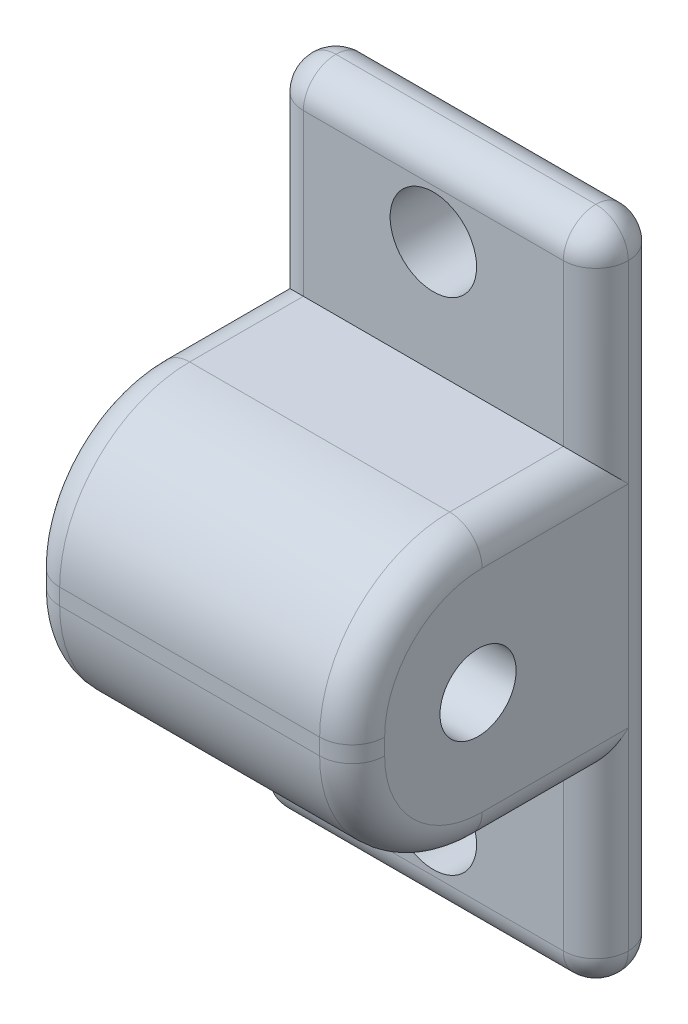
ISO-10303-21;
HEADER;
FILE_DESCRIPTION(('STEP AP214'),'2;1');
FILE_NAME('part.step','',(''),(''),'','','');
FILE_SCHEMA(('AUTOMOTIVE_DESIGN { 1 0 10303 214 1 1 1 1 }'));
ENDSEC;
DATA;
#1=APPLICATION_CONTEXT('core data for automotive mechanical design processes');
#2=APPLICATION_PROTOCOL_DEFINITION('international standard','automotive_design',2000,#1);
#3=PRODUCT_CONTEXT('',#1,'mechanical');
#4=PRODUCT('Part','Part','',(#3));
#5=PRODUCT_RELATED_PRODUCT_CATEGORY('part','',(#4));
#6=PRODUCT_DEFINITION_FORMATION('','',#4);
#7=PRODUCT_DEFINITION_CONTEXT('part definition',#1,'design');
#8=PRODUCT_DEFINITION('design','',#6,#7);
#9=PRODUCT_DEFINITION_SHAPE('','',#8);
#10=(LENGTH_UNIT() NAMED_UNIT(*) SI_UNIT(.MILLI.,.METRE.));
#11=(NAMED_UNIT(*) PLANE_ANGLE_UNIT() SI_UNIT($,.RADIAN.));
#12=(NAMED_UNIT(*) SI_UNIT($,.STERADIAN.) SOLID_ANGLE_UNIT());
#13=UNCERTAINTY_MEASURE_WITH_UNIT(LENGTH_MEASURE(1.E-05),#10,'distance_accuracy_value','');
#14=(GEOMETRIC_REPRESENTATION_CONTEXT(3) GLOBAL_UNCERTAINTY_ASSIGNED_CONTEXT((#13)) GLOBAL_UNIT_ASSIGNED_CONTEXT((#10,
#11,#12)) REPRESENTATION_CONTEXT('',''));
#15=CARTESIAN_POINT('',(0.,0.,0.));
#16=DIRECTION('',(0.,0.,1.));
#17=DIRECTION('',(1.,0.,0.));
#18=AXIS2_PLACEMENT_3D('',#15,#16,#17);
#19=CARTESIAN_POINT('',(-25.4,-10.795,5.08));
#20=DIRECTION('',(0.,0.,1.));
#21=DIRECTION('',(0.,-1.,0.));
#22=AXIS2_PLACEMENT_3D('',#19,#20,#21);
#23=PLANE('',#22);
#24=CARTESIAN_POINT('',(-12.7,-19.558,5.08));
#25=DIRECTION('',(0.,0.,1.));
#26=DIRECTION('',(1.,0.,0.));
#27=AXIS2_PLACEMENT_3D('',#24,#25,#26);
#28=CIRCLE('',#27,3.3782);
#29=CARTESIAN_POINT('',(-9.3218,-19.558,5.08));
#30=VERTEX_POINT('',#29);
#31=EDGE_CURVE('E322',#30,#30,#28,.T.);
#32=ORIENTED_EDGE('',*,*,#31,.F.);
#33=EDGE_LOOP('',(#32));
#34=FACE_BOUND('',#33,.T.);
#35=DIRECTION('',(0.,-1.,0.));
#36=VECTOR('',#35,1.);
#37=CARTESIAN_POINT('',(-25.4,-10.795,5.08));
#38=LINE('',#37,#36);
#39=CARTESIAN_POINT('',(-25.4,-8.255,5.08));
#40=VERTEX_POINT('',#39);
#41=CARTESIAN_POINT('',(-25.4,-23.368,5.08));
#42=VERTEX_POINT('',#41);
#43=EDGE_CURVE('E192',#40,#42,#38,.T.);
#44=ORIENTED_EDGE('',*,*,#43,.T.);
#45=DIRECTION('',(1.,0.,0.));
#46=VECTOR('',#45,1.);
#47=CARTESIAN_POINT('',(-25.4,-23.368,5.08));
#48=LINE('',#47,#46);
#49=CARTESIAN_POINT('',(-2.54,-23.368,5.08));
#50=VERTEX_POINT('',#49);
#51=EDGE_CURVE('E186',#42,#50,#48,.T.);
#52=ORIENTED_EDGE('',*,*,#51,.T.);
#53=DIRECTION('',(0.,-1.,0.));
#54=VECTOR('',#53,1.);
#55=CARTESIAN_POINT('',(-2.54,-10.795,5.08));
#56=LINE('',#55,#54);
#57=CARTESIAN_POINT('',(-2.54,-10.795,5.08));
#58=VERTEX_POINT('',#57);
#59=EDGE_CURVE('E190',#50,#58,#56,.F.);
#60=ORIENTED_EDGE('',*,*,#59,.T.);
#61=DIRECTION('',(1.,0.,0.));
#62=VECTOR('',#61,1.);
#63=CARTESIAN_POINT('',(-25.4,-10.795,5.08));
#64=LINE('',#63,#62);
#65=CARTESIAN_POINT('',(-22.86,-10.795,5.08));
#66=VERTEX_POINT('',#65);
#67=EDGE_CURVE('E336',#66,#58,#64,.T.);
#68=ORIENTED_EDGE('',*,*,#67,.F.);
#69=CARTESIAN_POINT('',(-22.86,-8.255,5.08));
#70=DIRECTION('',(0.,0.,1.));
#71=DIRECTION('',(0.,-1.,0.));
#72=AXIS2_PLACEMENT_3D('',#69,#70,#71);
#73=CIRCLE('',#72,2.54);
#74=EDGE_CURVE('E11',#66,#40,#73,.F.);
#75=ORIENTED_EDGE('',*,*,#74,.T.);
#76=EDGE_LOOP('',(#44,#52,#60,#68,#75));
#77=FACE_BOUND('',#76,.T.);
#78=ADVANCED_FACE('F35',(#34,#77),#23,.T.);
#79=CARTESIAN_POINT('',(-25.4,-10.795,13.9699999999999));
#80=DIRECTION('',(0.,-1.,0.));
#81=DIRECTION('',(0.,0.,-1.));
#82=AXIS2_PLACEMENT_3D('',#79,#80,#81);
#83=PLANE('',#82);
#84=ORIENTED_EDGE('',*,*,#67,.T.);
#85=DIRECTION('',(0.,0.,-1.));
#86=VECTOR('',#85,1.);
#87=CARTESIAN_POINT('',(-2.54,-10.795,13.9699999999999));
#88=LINE('',#87,#86);
#89=CARTESIAN_POINT('',(-2.54,-10.795,13.9699999999999));
#90=VERTEX_POINT('',#89);
#91=EDGE_CURVE('E380',#58,#90,#88,.F.);
#92=ORIENTED_EDGE('',*,*,#91,.T.);
#93=DIRECTION('',(1.,0.,0.));
#94=VECTOR('',#93,1.);
#95=CARTESIAN_POINT('',(-25.4,-10.795,13.9699999999999));
#96=LINE('',#95,#94);
#97=CARTESIAN_POINT('',(-22.86,-10.795,13.9699999999999));
#98=VERTEX_POINT('',#97);
#99=EDGE_CURVE('E339',#98,#90,#96,.T.);
#100=ORIENTED_EDGE('',*,*,#99,.F.);
#101=DIRECTION('',(0.,0.,-1.));
#102=VECTOR('',#101,1.);
#103=CARTESIAN_POINT('',(-22.86,-10.795,13.9699999999999));
#104=LINE('',#103,#102);
#105=EDGE_CURVE('E378',#98,#66,#104,.T.);
#106=ORIENTED_EDGE('',*,*,#105,.T.);
#107=EDGE_LOOP('',(#84,#92,#100,#106));
#108=FACE_BOUND('',#107,.T.);
#109=ADVANCED_FACE('F432',(#108),#83,.T.);
#110=CARTESIAN_POINT('',(-25.4,-0.634999999999998,13.97));
#111=DIRECTION('',(1.,0.,0.));
#112=DIRECTION('',(0.,0.,-1.));
#113=AXIS2_PLACEMENT_3D('',#110,#111,#112);
#114=CYLINDRICAL_SURFACE('',#113,10.16);
#115=DIRECTION('',(1.,0.,0.));
#116=VECTOR('',#115,1.);
#117=CARTESIAN_POINT('',(-25.4,-0.634999999999926,24.13));
#118=LINE('',#117,#116);
#119=CARTESIAN_POINT('',(-22.86,-0.634999999999926,24.13));
#120=VERTEX_POINT('',#119);
#121=CARTESIAN_POINT('',(-2.54,-0.634999999999926,24.13));
#122=VERTEX_POINT('',#121);
#123=EDGE_CURVE('E342',#120,#122,#118,.T.);
#124=ORIENTED_EDGE('',*,*,#123,.F.);
#125=CARTESIAN_POINT('',(-22.86,-0.634999999999998,13.97));
#126=DIRECTION('',(-1.,0.,0.));
#127=DIRECTION('',(0.,0.,1.));
#128=AXIS2_PLACEMENT_3D('',#125,#126,#127);
#129=CIRCLE('',#128,10.16);
#130=EDGE_CURVE('E398',#120,#98,#129,.F.);
#131=ORIENTED_EDGE('',*,*,#130,.T.);
#132=ORIENTED_EDGE('',*,*,#99,.T.);
#133=CARTESIAN_POINT('',(-2.54,-0.634999999999998,13.97));
#134=DIRECTION('',(-1.,0.,0.));
#135=DIRECTION('',(0.,0.,1.));
#136=AXIS2_PLACEMENT_3D('',#133,#134,#135);
#137=CIRCLE('',#136,10.16);
#138=EDGE_CURVE('E396',#90,#122,#137,.T.);
#139=ORIENTED_EDGE('',*,*,#138,.T.);
#140=EDGE_LOOP('',(#124,#131,#132,#139));
#141=FACE_BOUND('',#140,.T.);
#142=ADVANCED_FACE('F436',(#141),#114,.T.);
#143=CARTESIAN_POINT('',(-25.4,0.634999999999927,24.13));
#144=DIRECTION('',(0.,0.,1.));
#145=DIRECTION('',(1.,0.,0.));
#146=AXIS2_PLACEMENT_3D('',#143,#144,#145);
#147=PLANE('',#146);
#148=ORIENTED_EDGE('',*,*,#123,.T.);
#149=DIRECTION('',(0.,-1.,0.));
#150=VECTOR('',#149,1.);
#151=CARTESIAN_POINT('',(-2.54,0.634999999999928,24.13));
#152=LINE('',#151,#150);
#153=CARTESIAN_POINT('',(-2.54,0.634999999999928,24.13));
#154=VERTEX_POINT('',#153);
#155=EDGE_CURVE('E376',#122,#154,#152,.F.);
#156=ORIENTED_EDGE('',*,*,#155,.T.);
#157=DIRECTION('',(1.,0.,0.));
#158=VECTOR('',#157,1.);
#159=CARTESIAN_POINT('',(-25.4,0.634999999999928,24.13));
#160=LINE('',#159,#158);
#161=CARTESIAN_POINT('',(-22.86,0.634999999999928,24.13));
#162=VERTEX_POINT('',#161);
#163=EDGE_CURVE('E345',#162,#154,#160,.T.);
#164=ORIENTED_EDGE('',*,*,#163,.F.);
#165=DIRECTION('',(0.,-1.,0.));
#166=VECTOR('',#165,1.);
#167=CARTESIAN_POINT('',(-22.86,0.634999999999927,24.13));
#168=LINE('',#167,#166);
#169=EDGE_CURVE('E374',#162,#120,#168,.T.);
#170=ORIENTED_EDGE('',*,*,#169,.T.);
#171=EDGE_LOOP('',(#148,#156,#164,#170));
#172=FACE_BOUND('',#171,.T.);
#173=ADVANCED_FACE('F469',(#172),#147,.T.);
#174=CARTESIAN_POINT('',(-25.4,0.635,13.97));
#175=DIRECTION('',(1.,0.,0.));
#176=DIRECTION('',(0.,0.,-1.));
#177=AXIS2_PLACEMENT_3D('',#174,#175,#176);
#178=CYLINDRICAL_SURFACE('',#177,10.16);
#179=ORIENTED_EDGE('',*,*,#163,.T.);
#180=CARTESIAN_POINT('',(-2.54,0.635,13.97));
#181=DIRECTION('',(-1.,0.,0.));
#182=DIRECTION('',(0.,0.,1.));
#183=AXIS2_PLACEMENT_3D('',#180,#181,#182);
#184=CIRCLE('',#183,10.16);
#185=CARTESIAN_POINT('',(-2.54,10.795,13.9699999999999));
#186=VERTEX_POINT('',#185);
#187=EDGE_CURVE('E372',#154,#186,#184,.T.);
#188=ORIENTED_EDGE('',*,*,#187,.T.);
#189=DIRECTION('',(1.,0.,0.));
#190=VECTOR('',#189,1.);
#191=CARTESIAN_POINT('',(-25.4,10.795,13.9699999999999));
#192=LINE('',#191,#190);
#193=CARTESIAN_POINT('',(-22.86,10.795,13.9699999999999));
#194=VERTEX_POINT('',#193);
#195=EDGE_CURVE('E348',#194,#186,#192,.T.);
#196=ORIENTED_EDGE('',*,*,#195,.F.);
#197=CARTESIAN_POINT('',(-22.86,0.635,13.97));
#198=DIRECTION('',(-1.,0.,0.));
#199=DIRECTION('',(0.,0.,1.));
#200=AXIS2_PLACEMENT_3D('',#197,#198,#199);
#201=CIRCLE('',#200,10.16);
#202=EDGE_CURVE('E370',#194,#162,#201,.F.);
#203=ORIENTED_EDGE('',*,*,#202,.T.);
#204=EDGE_LOOP('',(#179,#188,#196,#203));
#205=FACE_BOUND('',#204,.T.);
#206=ADVANCED_FACE('F472',(#205),#178,.T.);
#207=CARTESIAN_POINT('',(-25.4,10.795,5.08));
#208=DIRECTION('',(0.,1.,0.));
#209=DIRECTION('',(0.,0.,1.));
#210=AXIS2_PLACEMENT_3D('',#207,#208,#209);
#211=PLANE('',#210);
#212=ORIENTED_EDGE('',*,*,#195,.T.);
#213=DIRECTION('',(0.,0.,1.));
#214=VECTOR('',#213,1.);
#215=CARTESIAN_POINT('',(-2.54,10.795,5.08));
#216=LINE('',#215,#214);
#217=CARTESIAN_POINT('',(-2.54,10.795,5.08));
#218=VERTEX_POINT('',#217);
#219=EDGE_CURVE('E367',#186,#218,#216,.F.);
#220=ORIENTED_EDGE('',*,*,#219,.T.);
#221=DIRECTION('',(1.,0.,0.));
#222=VECTOR('',#221,1.);
#223=CARTESIAN_POINT('',(-25.4,10.795,5.08));
#224=LINE('',#223,#222);
#225=CARTESIAN_POINT('',(-22.86,10.795,5.08));
#226=VERTEX_POINT('',#225);
#227=EDGE_CURVE('E335',#226,#218,#224,.T.);
#228=ORIENTED_EDGE('',*,*,#227,.F.);
#229=DIRECTION('',(0.,0.,1.));
#230=VECTOR('',#229,1.);
#231=CARTESIAN_POINT('',(-22.86,10.795,5.08));
#232=LINE('',#231,#230);
#233=EDGE_CURVE('E365',#226,#194,#232,.T.);
#234=ORIENTED_EDGE('',*,*,#233,.T.);
#235=EDGE_LOOP('',(#212,#220,#228,#234));
#236=FACE_BOUND('',#235,.T.);
#237=ADVANCED_FACE('F476',(#236),#211,.T.);
#238=CARTESIAN_POINT('',(-25.4,25.908,5.08));
#239=DIRECTION('',(0.,0.,1.));
#240=DIRECTION('',(0.,-1.,0.));
#241=AXIS2_PLACEMENT_3D('',#238,#239,#240);
#242=PLANE('',#241);
#243=CARTESIAN_POINT('',(-12.7,19.558,5.08));
#244=DIRECTION('',(0.,0.,1.));
#245=DIRECTION('',(1.,0.,0.));
#246=AXIS2_PLACEMENT_3D('',#243,#244,#245);
#247=CIRCLE('',#246,3.3782);
#248=CARTESIAN_POINT('',(-9.3218,19.558,5.08));
#249=VERTEX_POINT('',#248);
#250=EDGE_CURVE('E311',#249,#249,#247,.T.);
#251=ORIENTED_EDGE('',*,*,#250,.F.);
#252=EDGE_LOOP('',(#251));
#253=FACE_BOUND('',#252,.T.);
#254=ORIENTED_EDGE('',*,*,#227,.T.);
#255=DIRECTION('',(0.,-1.,0.));
#256=VECTOR('',#255,1.);
#257=CARTESIAN_POINT('',(-2.54,25.908,5.08));
#258=LINE('',#257,#256);
#259=CARTESIAN_POINT('',(-2.54,23.368,5.08));
#260=VERTEX_POINT('',#259);
#261=EDGE_CURVE('E45',#218,#260,#258,.F.);
#262=ORIENTED_EDGE('',*,*,#261,.T.);
#263=DIRECTION('',(1.,0.,0.));
#264=VECTOR('',#263,1.);
#265=CARTESIAN_POINT('',(-25.4,23.368,5.08));
#266=LINE('',#265,#264);
#267=CARTESIAN_POINT('',(-22.86,23.368,5.08));
#268=VERTEX_POINT('',#267);
#269=EDGE_CURVE('E225',#260,#268,#266,.F.);
#270=ORIENTED_EDGE('',*,*,#269,.T.);
#271=DIRECTION('',(0.,-1.,0.));
#272=VECTOR('',#271,1.);
#273=CARTESIAN_POINT('',(-22.86,25.908,5.08));
#274=LINE('',#273,#272);
#275=EDGE_CURVE('E194',#268,#226,#274,.T.);
#276=ORIENTED_EDGE('',*,*,#275,.T.);
#277=EDGE_LOOP('',(#254,#262,#270,#276));
#278=FACE_BOUND('',#277,.T.);
#279=ADVANCED_FACE('F480',(#253,#278),#242,.T.);
#280=CARTESIAN_POINT('',(-25.4,0.,0.));
#281=DIRECTION('',(0.,0.,-1.));
#282=DIRECTION('',(-1.,0.,0.));
#283=AXIS2_PLACEMENT_3D('',#280,#281,#282);
#284=PLANE('',#283);
#285=DIRECTION('',(1.,0.,0.));
#286=VECTOR('',#285,1.);
#287=CARTESIAN_POINT('',(-25.4,23.368,0.));
#288=LINE('',#287,#286);
#289=CARTESIAN_POINT('',(-22.86,23.368,0.));
#290=VERTEX_POINT('',#289);
#291=CARTESIAN_POINT('',(-2.54,23.368,0.));
#292=VERTEX_POINT('',#291);
#293=EDGE_CURVE('E402',#290,#292,#288,.T.);
#294=ORIENTED_EDGE('',*,*,#293,.T.);
#295=DIRECTION('',(0.,1.,0.));
#296=VECTOR('',#295,1.);
#297=CARTESIAN_POINT('',(-2.54,-25.908,0.));
#298=LINE('',#297,#296);
#299=CARTESIAN_POINT('',(-2.54,-23.368,0.));
#300=VERTEX_POINT('',#299);
#301=EDGE_CURVE('E218',#292,#300,#298,.F.);
#302=ORIENTED_EDGE('',*,*,#301,.T.);
#303=DIRECTION('',(1.,0.,0.));
#304=VECTOR('',#303,1.);
#305=CARTESIAN_POINT('',(-25.4,-23.368,0.));
#306=LINE('',#305,#304);
#307=CARTESIAN_POINT('',(-22.86,-23.368,0.));
#308=VERTEX_POINT('',#307);
#309=EDGE_CURVE('E220',#300,#308,#306,.F.);
#310=ORIENTED_EDGE('',*,*,#309,.T.);
#311=DIRECTION('',(0.,1.,0.));
#312=VECTOR('',#311,1.);
#313=CARTESIAN_POINT('',(-22.86,0.,0.));
#314=LINE('',#313,#312);
#315=EDGE_CURVE('E400',#308,#290,#314,.T.);
#316=ORIENTED_EDGE('',*,*,#315,.T.);
#317=EDGE_LOOP('',(#294,#302,#310,#316));
#318=FACE_BOUND('',#317,.T.);
#319=CARTESIAN_POINT('',(-12.7,19.558,0.));
#320=DIRECTION('',(0.,0.,-1.));
#321=DIRECTION('',(-1.,0.,0.));
#322=AXIS2_PLACEMENT_3D('',#319,#320,#321);
#323=CIRCLE('',#322,3.3782);
#324=CARTESIAN_POINT('',(-16.0782,19.558,0.));
#325=VERTEX_POINT('',#324);
#326=EDGE_CURVE('E317',#325,#325,#323,.T.);
#327=ORIENTED_EDGE('',*,*,#326,.F.);
#328=EDGE_LOOP('',(#327));
#329=FACE_BOUND('',#328,.T.);
#330=CARTESIAN_POINT('',(-12.7,-19.558,0.));
#331=DIRECTION('',(0.,0.,-1.));
#332=DIRECTION('',(-1.,0.,0.));
#333=AXIS2_PLACEMENT_3D('',#330,#331,#332);
#334=CIRCLE('',#333,3.3782);
#335=CARTESIAN_POINT('',(-16.0782,-19.558,0.));
#336=VERTEX_POINT('',#335);
#337=EDGE_CURVE('E327',#336,#336,#334,.T.);
#338=ORIENTED_EDGE('',*,*,#337,.F.);
#339=EDGE_LOOP('',(#338));
#340=FACE_BOUND('',#339,.T.);
#341=ADVANCED_FACE('F406',(#318,#329,#340),#284,.T.);
#342=CARTESIAN_POINT('',(-25.4,0.635,13.97));
#343=DIRECTION('',(-1.,0.,0.));
#344=DIRECTION('',(0.,0.,1.));
#345=AXIS2_PLACEMENT_3D('',#342,#343,#344);
#346=PLANE('',#345);
#347=CARTESIAN_POINT('',(-25.4,0.,14.2875));
#348=DIRECTION('',(1.,0.,0.));
#349=DIRECTION('',(0.,0.,-1.));
#350=AXIS2_PLACEMENT_3D('',#347,#348,#349);
#351=CIRCLE('',#350,2.97662599999999);
#352=CARTESIAN_POINT('',(-25.4,0.,11.310874));
#353=VERTEX_POINT('',#352);
#354=EDGE_CURVE('E331',#353,#353,#351,.T.);
#355=ORIENTED_EDGE('',*,*,#354,.T.);
#356=EDGE_LOOP('',(#355));
#357=FACE_BOUND('',#356,.T.);
#358=DIRECTION('',(0.,1.,0.));
#359=VECTOR('',#358,1.);
#360=CARTESIAN_POINT('',(-25.4,0.635,2.54));
#361=LINE('',#360,#359);
#362=CARTESIAN_POINT('',(-25.4,8.255,2.54));
#363=VERTEX_POINT('',#362);
#364=CARTESIAN_POINT('',(-25.4,-23.368,2.54));
#365=VERTEX_POINT('',#364);
#366=EDGE_CURVE('E392',#363,#365,#361,.F.);
#367=ORIENTED_EDGE('',*,*,#366,.T.);
#368=DIRECTION('',(0.,0.,-1.));
#369=VECTOR('',#368,1.);
#370=CARTESIAN_POINT('',(-25.4,-23.368,13.97));
#371=LINE('',#370,#369);
#372=EDGE_CURVE('E394',#365,#42,#371,.F.);
#373=ORIENTED_EDGE('',*,*,#372,.T.);
#374=ORIENTED_EDGE('',*,*,#43,.F.);
#375=DIRECTION('',(0.,0.,-1.));
#376=VECTOR('',#375,1.);
#377=CARTESIAN_POINT('',(-25.4,-8.255,13.97));
#378=LINE('',#377,#376);
#379=CARTESIAN_POINT('',(-25.4,-8.255,13.9699999999999));
#380=VERTEX_POINT('',#379);
#381=EDGE_CURVE('E388',#40,#380,#378,.F.);
#382=ORIENTED_EDGE('',*,*,#381,.T.);
#383=CARTESIAN_POINT('',(-25.4,-0.634999999999998,13.97));
#384=DIRECTION('',(-1.,0.,0.));
#385=DIRECTION('',(0.,0.,1.));
#386=AXIS2_PLACEMENT_3D('',#383,#384,#385);
#387=CIRCLE('',#386,7.62);
#388=CARTESIAN_POINT('',(-25.4,-0.634999999999944,21.59));
#389=VERTEX_POINT('',#388);
#390=EDGE_CURVE('E386',#380,#389,#387,.T.);
#391=ORIENTED_EDGE('',*,*,#390,.T.);
#392=DIRECTION('',(0.,-1.,0.));
#393=VECTOR('',#392,1.);
#394=CARTESIAN_POINT('',(-25.4,0.635,21.59));
#395=LINE('',#394,#393);
#396=CARTESIAN_POINT('',(-25.4,0.634999999999928,21.59));
#397=VERTEX_POINT('',#396);
#398=EDGE_CURVE('E384',#389,#397,#395,.F.);
#399=ORIENTED_EDGE('',*,*,#398,.T.);
#400=CARTESIAN_POINT('',(-25.4,0.635,13.97));
#401=DIRECTION('',(-1.,0.,0.));
#402=DIRECTION('',(0.,0.,1.));
#403=AXIS2_PLACEMENT_3D('',#400,#401,#402);
#404=CIRCLE('',#403,7.62);
#405=CARTESIAN_POINT('',(-25.4,8.255,13.9699999999999));
#406=VERTEX_POINT('',#405);
#407=EDGE_CURVE('E382',#397,#406,#404,.T.);
#408=ORIENTED_EDGE('',*,*,#407,.T.);
#409=DIRECTION('',(0.,0.,1.));
#410=VECTOR('',#409,1.);
#411=CARTESIAN_POINT('',(-25.4,8.255,13.97));
#412=LINE('',#411,#410);
#413=EDGE_CURVE('E390',#406,#363,#412,.F.);
#414=ORIENTED_EDGE('',*,*,#413,.T.);
#415=EDGE_LOOP('',(#367,#373,#374,#382,#391,#399,#408,#414));
#416=FACE_BOUND('',#415,.T.);
#417=ADVANCED_FACE('F442',(#357,#416),#346,.T.);
#418=CARTESIAN_POINT('',(0.,0.635,13.97));
#419=DIRECTION('',(-1.,0.,0.));
#420=DIRECTION('',(0.,0.,1.));
#421=AXIS2_PLACEMENT_3D('',#418,#419,#420);
#422=PLANE('',#421);
#423=DIRECTION('',(0.,0.,-1.));
#424=VECTOR('',#423,1.);
#425=CARTESIAN_POINT('',(0.,-8.255,5.08));
#426=LINE('',#425,#424);
#427=CARTESIAN_POINT('',(0.,-8.255,13.9699999999999));
#428=VERTEX_POINT('',#427);
#429=CARTESIAN_POINT('',(0.,-8.255,2.54));
#430=VERTEX_POINT('',#429);
#431=EDGE_CURVE('E355',#428,#430,#426,.T.);
#432=ORIENTED_EDGE('',*,*,#431,.T.);
#433=DIRECTION('',(0.,1.,0.));
#434=VECTOR('',#433,1.);
#435=CARTESIAN_POINT('',(0.,25.908,2.54));
#436=LINE('',#435,#434);
#437=CARTESIAN_POINT('',(0.,8.255,2.54));
#438=VERTEX_POINT('',#437);
#439=EDGE_CURVE('E363',#430,#438,#436,.T.);
#440=ORIENTED_EDGE('',*,*,#439,.T.);
#441=DIRECTION('',(0.,0.,1.));
#442=VECTOR('',#441,1.);
#443=CARTESIAN_POINT('',(0.,8.255,13.9699999999999));
#444=LINE('',#443,#442);
#445=CARTESIAN_POINT('',(0.,8.255,13.9699999999999));
#446=VERTEX_POINT('',#445);
#447=EDGE_CURVE('E360',#438,#446,#444,.T.);
#448=ORIENTED_EDGE('',*,*,#447,.T.);
#449=CARTESIAN_POINT('',(0.,0.635,13.97));
#450=DIRECTION('',(-1.,0.,0.));
#451=DIRECTION('',(0.,0.,1.));
#452=AXIS2_PLACEMENT_3D('',#449,#450,#451);
#453=CIRCLE('',#452,7.62);
#454=CARTESIAN_POINT('',(0.,0.634999999999946,21.59));
#455=VERTEX_POINT('',#454);
#456=EDGE_CURVE('E358',#446,#455,#453,.F.);
#457=ORIENTED_EDGE('',*,*,#456,.T.);
#458=DIRECTION('',(0.,-1.,0.));
#459=VECTOR('',#458,1.);
#460=CARTESIAN_POINT('',(0.,-0.634999999999926,21.59));
#461=LINE('',#460,#459);
#462=CARTESIAN_POINT('',(0.,-0.634999999999926,21.59));
#463=VERTEX_POINT('',#462);
#464=EDGE_CURVE('E96',#455,#463,#461,.T.);
#465=ORIENTED_EDGE('',*,*,#464,.T.);
#466=CARTESIAN_POINT('',(0.,-0.634999999999998,13.97));
#467=DIRECTION('',(-1.,0.,0.));
#468=DIRECTION('',(0.,0.,1.));
#469=AXIS2_PLACEMENT_3D('',#466,#467,#468);
#470=CIRCLE('',#469,7.62);
#471=EDGE_CURVE('E338',#463,#428,#470,.F.);
#472=ORIENTED_EDGE('',*,*,#471,.T.);
#473=EDGE_LOOP('',(#432,#440,#448,#457,#465,#472));
#474=FACE_BOUND('',#473,.T.);
#475=CARTESIAN_POINT('',(0.,0.,14.2875));
#476=DIRECTION('',(1.,0.,0.));
#477=DIRECTION('',(0.,0.,-1.));
#478=AXIS2_PLACEMENT_3D('',#475,#476,#477);
#479=CIRCLE('',#478,2.976626);
#480=CARTESIAN_POINT('',(0.,0.,11.310874));
#481=VERTEX_POINT('',#480);
#482=EDGE_CURVE('E328',#481,#481,#479,.T.);
#483=ORIENTED_EDGE('',*,*,#482,.F.);
#484=EDGE_LOOP('',(#483));
#485=FACE_BOUND('',#484,.T.);
#486=ADVANCED_FACE('F421',(#474,#485),#422,.F.);
#487=CARTESIAN_POINT('',(0.,0.,14.2875));
#488=DIRECTION('',(1.,0.,0.));
#489=DIRECTION('',(0.,0.,-1.));
#490=AXIS2_PLACEMENT_3D('',#487,#488,#489);
#491=CYLINDRICAL_SURFACE('',#490,2.976626);
#492=ORIENTED_EDGE('',*,*,#354,.F.);
#493=EDGE_LOOP('',(#492));
#494=FACE_BOUND('',#493,.T.);
#495=ORIENTED_EDGE('',*,*,#482,.T.);
#496=EDGE_LOOP('',(#495));
#497=FACE_BOUND('',#496,.T.);
#498=ADVANCED_FACE('F740',(#494,#497),#491,.F.);
#499=CARTESIAN_POINT('',(-12.7,-19.558,5.08));
#500=DIRECTION('',(0.,0.,1.));
#501=DIRECTION('',(1.,0.,0.));
#502=AXIS2_PLACEMENT_3D('',#499,#500,#501);
#503=CYLINDRICAL_SURFACE('',#502,3.3782);
#504=ORIENTED_EDGE('',*,*,#337,.T.);
#505=EDGE_LOOP('',(#504));
#506=FACE_BOUND('',#505,.T.);
#507=ORIENTED_EDGE('',*,*,#31,.T.);
#508=EDGE_LOOP('',(#507));
#509=FACE_BOUND('',#508,.T.);
#510=ADVANCED_FACE('F453',(#506,#509),#503,.F.);
#511=CARTESIAN_POINT('',(-12.7,19.558,5.08));
#512=DIRECTION('',(0.,0.,1.));
#513=DIRECTION('',(1.,0.,0.));
#514=AXIS2_PLACEMENT_3D('',#511,#512,#513);
#515=CYLINDRICAL_SURFACE('',#514,3.3782);
#516=ORIENTED_EDGE('',*,*,#326,.T.);
#517=EDGE_LOOP('',(#516));
#518=FACE_BOUND('',#517,.T.);
#519=ORIENTED_EDGE('',*,*,#250,.T.);
#520=EDGE_LOOP('',(#519));
#521=FACE_BOUND('',#520,.T.);
#522=ADVANCED_FACE('F448',(#518,#521),#515,.F.);
#523=CARTESIAN_POINT('',(-22.86,-8.255,13.9699999999999));
#524=DIRECTION('',(0.,0.,-1.));
#525=DIRECTION('',(-1.,0.,0.));
#526=AXIS2_PLACEMENT_3D('',#523,#524,#525);
#527=CYLINDRICAL_SURFACE('',#526,2.54);
#528=ORIENTED_EDGE('',*,*,#74,.F.);
#529=ORIENTED_EDGE('',*,*,#105,.F.);
#530=CARTESIAN_POINT('',(-22.86,-8.255,13.9699999999999));
#531=DIRECTION('',(0.,0.,1.));
#532=DIRECTION('',(1.,0.,0.));
#533=AXIS2_PLACEMENT_3D('',#530,#531,#532);
#534=CIRCLE('',#533,2.54);
#535=EDGE_CURVE('E39',#380,#98,#534,.T.);
#536=ORIENTED_EDGE('',*,*,#535,.F.);
#537=ORIENTED_EDGE('',*,*,#381,.F.);
#538=EDGE_LOOP('',(#528,#529,#536,#537));
#539=FACE_BOUND('',#538,.T.);
#540=ADVANCED_FACE('F37',(#539),#527,.T.);
#541=CARTESIAN_POINT('',(-22.86,-0.634999999999998,13.97));
#542=DIRECTION('',(-1.,0.,0.));
#543=DIRECTION('',(0.,0.,1.));
#544=AXIS2_PLACEMENT_3D('',#541,#542,#543);
#545=TOROIDAL_SURFACE('',#544,7.62,2.54);
#546=ORIENTED_EDGE('',*,*,#535,.T.);
#547=ORIENTED_EDGE('',*,*,#130,.F.);
#548=CARTESIAN_POINT('',(-22.86,-0.634999999999944,21.59));
#549=DIRECTION('',(0.,1.,0.));
#550=DIRECTION('',(0.,0.,1.));
#551=AXIS2_PLACEMENT_3D('',#548,#549,#550);
#552=CIRCLE('',#551,2.54);
#553=EDGE_CURVE('E304',#389,#120,#552,.T.);
#554=ORIENTED_EDGE('',*,*,#553,.F.);
#555=ORIENTED_EDGE('',*,*,#390,.F.);
#556=EDGE_LOOP('',(#546,#547,#554,#555));
#557=FACE_BOUND('',#556,.T.);
#558=ADVANCED_FACE('F437',(#557),#545,.T.);
#559=CARTESIAN_POINT('',(-22.86,0.634999999999927,21.59));
#560=DIRECTION('',(0.,-1.,0.));
#561=DIRECTION('',(0.,0.,-1.));
#562=AXIS2_PLACEMENT_3D('',#559,#560,#561);
#563=CYLINDRICAL_SURFACE('',#562,2.54);
#564=ORIENTED_EDGE('',*,*,#553,.T.);
#565=ORIENTED_EDGE('',*,*,#169,.F.);
#566=CARTESIAN_POINT('',(-22.86,0.634999999999928,21.59));
#567=DIRECTION('',(0.,1.,0.));
#568=DIRECTION('',(0.,0.,1.));
#569=AXIS2_PLACEMENT_3D('',#566,#567,#568);
#570=CIRCLE('',#569,2.54);
#571=EDGE_CURVE('E302',#397,#162,#570,.T.);
#572=ORIENTED_EDGE('',*,*,#571,.F.);
#573=ORIENTED_EDGE('',*,*,#398,.F.);
#574=EDGE_LOOP('',(#564,#565,#572,#573));
#575=FACE_BOUND('',#574,.T.);
#576=ADVANCED_FACE('F439',(#575),#563,.T.);
#577=CARTESIAN_POINT('',(-22.86,0.635,13.97));
#578=DIRECTION('',(-1.,0.,0.));
#579=DIRECTION('',(0.,0.,1.));
#580=AXIS2_PLACEMENT_3D('',#577,#578,#579);
#581=TOROIDAL_SURFACE('',#580,7.62,2.54);
#582=ORIENTED_EDGE('',*,*,#571,.T.);
#583=ORIENTED_EDGE('',*,*,#202,.F.);
#584=CARTESIAN_POINT('',(-22.86,8.255,13.9699999999999));
#585=DIRECTION('',(0.,0.,-1.));
#586=DIRECTION('',(-1.,0.,0.));
#587=AXIS2_PLACEMENT_3D('',#584,#585,#586);
#588=CIRCLE('',#587,2.54);
#589=EDGE_CURVE('E299',#406,#194,#588,.T.);
#590=ORIENTED_EDGE('',*,*,#589,.F.);
#591=ORIENTED_EDGE('',*,*,#407,.F.);
#592=EDGE_LOOP('',(#582,#583,#590,#591));
#593=FACE_BOUND('',#592,.T.);
#594=ADVANCED_FACE('F562',(#593),#581,.T.);
#595=CARTESIAN_POINT('',(-22.86,8.255,5.08));
#596=DIRECTION('',(0.,0.,1.));
#597=DIRECTION('',(1.,0.,0.));
#598=AXIS2_PLACEMENT_3D('',#595,#596,#597);
#599=CYLINDRICAL_SURFACE('',#598,2.54);
#600=ORIENTED_EDGE('',*,*,#589,.T.);
#601=ORIENTED_EDGE('',*,*,#233,.F.);
#602=CARTESIAN_POINT('',(-22.86,8.255,2.54));
#603=DIRECTION('',(0.,-0.707106781186548,0.707106781186547));
#604=DIRECTION('',(0.,0.707106781186547,0.707106781186548));
#605=AXIS2_PLACEMENT_3D('',#602,#603,#604);
#606=ELLIPSE('',#605,3.59210244842766,2.54);
#607=EDGE_CURVE('E296',#363,#226,#606,.F.);
#608=ORIENTED_EDGE('',*,*,#607,.F.);
#609=ORIENTED_EDGE('',*,*,#413,.F.);
#610=EDGE_LOOP('',(#600,#601,#608,#609));
#611=FACE_BOUND('',#610,.T.);
#612=ADVANCED_FACE('F559',(#611),#599,.T.);
#613=CARTESIAN_POINT('',(-22.86,0.,2.54));
#614=DIRECTION('',(0.,1.,0.));
#615=DIRECTION('',(0.,0.,1.));
#616=AXIS2_PLACEMENT_3D('',#613,#614,#615);
#617=CYLINDRICAL_SURFACE('',#616,2.54);
#618=CARTESIAN_POINT('',(-22.86,-23.368,2.54));
#619=DIRECTION('',(0.,-1.,0.));
#620=DIRECTION('',(0.,0.,-1.));
#621=AXIS2_PLACEMENT_3D('',#618,#619,#620);
#622=CIRCLE('',#621,2.54);
#623=EDGE_CURVE('E289',#365,#308,#622,.T.);
#624=ORIENTED_EDGE('',*,*,#623,.F.);
#625=ORIENTED_EDGE('',*,*,#366,.F.);
#626=DIRECTION('',(0.,1.,0.));
#627=VECTOR('',#626,1.);
#628=CARTESIAN_POINT('',(-25.4,0.635,2.54));
#629=LINE('',#628,#627);
#630=CARTESIAN_POINT('',(-25.4,23.368,2.54));
#631=VERTEX_POINT('',#630);
#632=EDGE_CURVE('E87',#631,#363,#629,.F.);
#633=ORIENTED_EDGE('',*,*,#632,.F.);
#634=CARTESIAN_POINT('',(-22.86,23.368,2.54));
#635=DIRECTION('',(0.,1.,0.));
#636=DIRECTION('',(0.,0.,1.));
#637=AXIS2_PLACEMENT_3D('',#634,#635,#636);
#638=CIRCLE('',#637,2.54);
#639=EDGE_CURVE('E292',#290,#631,#638,.T.);
#640=ORIENTED_EDGE('',*,*,#639,.F.);
#641=ORIENTED_EDGE('',*,*,#315,.F.);
#642=EDGE_LOOP('',(#624,#625,#633,#640,#641));
#643=FACE_BOUND('',#642,.T.);
#644=ADVANCED_FACE('F556',(#643),#617,.T.);
#645=CARTESIAN_POINT('',(-22.86,-23.368,5.07999999999999));
#646=DIRECTION('',(0.,0.,-1.));
#647=DIRECTION('',(-1.,0.,0.));
#648=AXIS2_PLACEMENT_3D('',#645,#646,#647);
#649=CYLINDRICAL_SURFACE('',#648,2.54);
#650=CARTESIAN_POINT('',(-22.86,-23.368,2.54));
#651=DIRECTION('',(0.707106781186547,0.,0.707106781186547));
#652=DIRECTION('',(0.707106781186547,0.,-0.707106781186547));
#653=AXIS2_PLACEMENT_3D('',#650,#651,#652);
#654=ELLIPSE('',#653,3.59210244842766,2.54);
#655=CARTESIAN_POINT('',(-22.86,-25.908,2.54));
#656=VERTEX_POINT('',#655);
#657=EDGE_CURVE('E286',#42,#656,#654,.T.);
#658=ORIENTED_EDGE('',*,*,#657,.F.);
#659=ORIENTED_EDGE('',*,*,#372,.F.);
#660=CARTESIAN_POINT('',(-22.86,-23.368,2.54));
#661=DIRECTION('',(0.,0.,-1.));
#662=DIRECTION('',(-1.,0.,0.));
#663=AXIS2_PLACEMENT_3D('',#660,#661,#662);
#664=CIRCLE('',#663,2.54);
#665=EDGE_CURVE('E79',#656,#365,#664,.T.);
#666=ORIENTED_EDGE('',*,*,#665,.F.);
#667=EDGE_LOOP('',(#658,#659,#666));
#668=FACE_BOUND('',#667,.T.);
#669=ADVANCED_FACE('F552',(#668),#649,.T.);
#670=CARTESIAN_POINT('',(-22.86,25.908,2.54));
#671=DIRECTION('',(0.,-1.,0.));
#672=DIRECTION('',(0.,0.,-1.));
#673=AXIS2_PLACEMENT_3D('',#670,#671,#672);
#674=CYLINDRICAL_SURFACE('',#673,2.54);
#675=CARTESIAN_POINT('',(-22.86,23.368,2.54));
#676=DIRECTION('',(0.,1.,0.));
#677=DIRECTION('',(0.,0.,1.));
#678=AXIS2_PLACEMENT_3D('',#675,#676,#677);
#679=CIRCLE('',#678,2.54);
#680=EDGE_CURVE('E283',#631,#268,#679,.T.);
#681=ORIENTED_EDGE('',*,*,#680,.F.);
#682=ORIENTED_EDGE('',*,*,#632,.T.);
#683=ORIENTED_EDGE('',*,*,#607,.T.);
#684=ORIENTED_EDGE('',*,*,#275,.F.);
#685=EDGE_LOOP('',(#681,#682,#683,#684));
#686=FACE_BOUND('',#685,.T.);
#687=ADVANCED_FACE('F548',(#686),#674,.T.);
#688=CARTESIAN_POINT('',(-22.86,23.368,2.54));
#689=DIRECTION('',(0.,0.,1.));
#690=DIRECTION('',(1.,0.,0.));
#691=AXIS2_PLACEMENT_3D('',#688,#689,#690);
#692=SPHERICAL_SURFACE('',#691,2.54);
#693=ORIENTED_EDGE('',*,*,#639,.T.);
#694=CARTESIAN_POINT('',(-22.86,23.368,2.54));
#695=DIRECTION('',(0.,0.,1.));
#696=DIRECTION('',(1.,0.,0.));
#697=AXIS2_PLACEMENT_3D('',#694,#695,#696);
#698=CIRCLE('',#697,2.54);
#699=CARTESIAN_POINT('',(-22.86,25.908,2.54));
#700=VERTEX_POINT('',#699);
#701=EDGE_CURVE('E281',#700,#631,#698,.T.);
#702=ORIENTED_EDGE('',*,*,#701,.F.);
#703=CARTESIAN_POINT('',(-22.86,23.368,2.54));
#704=DIRECTION('',(-1.,0.,0.));
#705=DIRECTION('',(0.,0.,1.));
#706=AXIS2_PLACEMENT_3D('',#703,#704,#705);
#707=CIRCLE('',#706,2.54);
#708=EDGE_CURVE('E278',#290,#700,#707,.F.);
#709=ORIENTED_EDGE('',*,*,#708,.F.);
#710=EDGE_LOOP('',(#693,#702,#709));
#711=FACE_BOUND('',#710,.T.);
#712=ADVANCED_FACE('F544',(#711),#692,.T.);
#713=CARTESIAN_POINT('',(-22.86,-23.368,2.54));
#714=DIRECTION('',(0.,0.,1.));
#715=DIRECTION('',(1.,0.,0.));
#716=AXIS2_PLACEMENT_3D('',#713,#714,#715);
#717=SPHERICAL_SURFACE('',#716,2.54);
#718=ORIENTED_EDGE('',*,*,#665,.T.);
#719=ORIENTED_EDGE('',*,*,#623,.T.);
#720=CARTESIAN_POINT('',(-22.86,-23.368,2.54));
#721=DIRECTION('',(-1.,0.,0.));
#722=DIRECTION('',(0.,0.,1.));
#723=AXIS2_PLACEMENT_3D('',#720,#721,#722);
#724=CIRCLE('',#723,2.54);
#725=EDGE_CURVE('E276',#656,#308,#724,.F.);
#726=ORIENTED_EDGE('',*,*,#725,.F.);
#727=EDGE_LOOP('',(#718,#719,#726));
#728=FACE_BOUND('',#727,.T.);
#729=ADVANCED_FACE('F541',(#728),#717,.T.);
#730=CARTESIAN_POINT('',(-25.4,-23.368,2.54));
#731=DIRECTION('',(1.,0.,0.));
#732=DIRECTION('',(0.,0.,-1.));
#733=AXIS2_PLACEMENT_3D('',#730,#731,#732);
#734=CYLINDRICAL_SURFACE('',#733,2.54);
#735=ORIENTED_EDGE('',*,*,#51,.F.);
#736=ORIENTED_EDGE('',*,*,#657,.T.);
#737=DIRECTION('',(1.,0.,0.));
#738=VECTOR('',#737,1.);
#739=CARTESIAN_POINT('',(-25.4,-25.908,2.54));
#740=LINE('',#739,#738);
#741=CARTESIAN_POINT('',(-2.54,-25.908,2.54));
#742=VERTEX_POINT('',#741);
#743=EDGE_CURVE('E201',#742,#656,#740,.F.);
#744=ORIENTED_EDGE('',*,*,#743,.F.);
#745=CARTESIAN_POINT('',(-2.54,-23.368,2.54));
#746=DIRECTION('',(1.,0.,0.));
#747=DIRECTION('',(0.,0.,-1.));
#748=AXIS2_PLACEMENT_3D('',#745,#746,#747);
#749=CIRCLE('',#748,2.54);
#750=EDGE_CURVE('E197',#50,#742,#749,.T.);
#751=ORIENTED_EDGE('',*,*,#750,.F.);
#752=EDGE_LOOP('',(#735,#736,#744,#751));
#753=FACE_BOUND('',#752,.T.);
#754=ADVANCED_FACE('F199',(#753),#734,.T.);
#755=CARTESIAN_POINT('',(-22.86,23.368,2.54));
#756=DIRECTION('',(0.,0.,1.));
#757=DIRECTION('',(1.,0.,0.));
#758=AXIS2_PLACEMENT_3D('',#755,#756,#757);
#759=SPHERICAL_SURFACE('',#758,2.54);
#760=ORIENTED_EDGE('',*,*,#701,.T.);
#761=ORIENTED_EDGE('',*,*,#680,.T.);
#762=CARTESIAN_POINT('',(-22.86,23.368,2.54));
#763=DIRECTION('',(-1.,0.,0.));
#764=DIRECTION('',(0.,0.,1.));
#765=AXIS2_PLACEMENT_3D('',#762,#763,#764);
#766=CIRCLE('',#765,2.54);
#767=EDGE_CURVE('E204',#700,#268,#766,.F.);
#768=ORIENTED_EDGE('',*,*,#767,.F.);
#769=EDGE_LOOP('',(#760,#761,#768));
#770=FACE_BOUND('',#769,.T.);
#771=ADVANCED_FACE('F534',(#770),#759,.T.);
#772=CARTESIAN_POINT('',(-25.4,23.368,2.54));
#773=DIRECTION('',(1.,0.,0.));
#774=DIRECTION('',(0.,0.,-1.));
#775=AXIS2_PLACEMENT_3D('',#772,#773,#774);
#776=CYLINDRICAL_SURFACE('',#775,2.54);
#777=ORIENTED_EDGE('',*,*,#293,.F.);
#778=ORIENTED_EDGE('',*,*,#708,.T.);
#779=DIRECTION('',(1.,0.,0.));
#780=VECTOR('',#779,1.);
#781=CARTESIAN_POINT('',(-25.4,25.908,2.54));
#782=LINE('',#781,#780);
#783=CARTESIAN_POINT('',(-2.54,25.908,2.54));
#784=VERTEX_POINT('',#783);
#785=EDGE_CURVE('E270',#784,#700,#782,.F.);
#786=ORIENTED_EDGE('',*,*,#785,.F.);
#787=CARTESIAN_POINT('',(-2.54,23.368,2.54));
#788=DIRECTION('',(1.,0.,0.));
#789=DIRECTION('',(0.,0.,-1.));
#790=AXIS2_PLACEMENT_3D('',#787,#788,#789);
#791=CIRCLE('',#790,2.54);
#792=EDGE_CURVE('E267',#292,#784,#791,.T.);
#793=ORIENTED_EDGE('',*,*,#792,.F.);
#794=EDGE_LOOP('',(#777,#778,#786,#793));
#795=FACE_BOUND('',#794,.T.);
#796=ADVANCED_FACE('F531',(#795),#776,.T.);
#797=CARTESIAN_POINT('',(-25.4,-23.368,2.54));
#798=DIRECTION('',(1.,0.,0.));
#799=DIRECTION('',(0.,0.,-1.));
#800=AXIS2_PLACEMENT_3D('',#797,#798,#799);
#801=CYLINDRICAL_SURFACE('',#800,2.54);
#802=CARTESIAN_POINT('',(-2.54,-23.368,2.54));
#803=DIRECTION('',(1.,0.,0.));
#804=DIRECTION('',(0.,0.,-1.));
#805=AXIS2_PLACEMENT_3D('',#802,#803,#804);
#806=CIRCLE('',#805,2.54);
#807=EDGE_CURVE('E264',#742,#300,#806,.T.);
#808=ORIENTED_EDGE('',*,*,#807,.F.);
#809=ORIENTED_EDGE('',*,*,#743,.T.);
#810=ORIENTED_EDGE('',*,*,#725,.T.);
#811=ORIENTED_EDGE('',*,*,#309,.F.);
#812=EDGE_LOOP('',(#808,#809,#810,#811));
#813=FACE_BOUND('',#812,.T.);
#814=ADVANCED_FACE('F412',(#813),#801,.T.);
#815=CARTESIAN_POINT('',(-2.54,-23.368,2.54));
#816=DIRECTION('',(0.,0.,1.));
#817=DIRECTION('',(1.,0.,0.));
#818=AXIS2_PLACEMENT_3D('',#815,#816,#817);
#819=SPHERICAL_SURFACE('',#818,2.54);
#820=ORIENTED_EDGE('',*,*,#750,.T.);
#821=CARTESIAN_POINT('',(-2.54,-23.368,2.54));
#822=DIRECTION('',(0.,0.,-1.));
#823=DIRECTION('',(0.,1.,0.));
#824=AXIS2_PLACEMENT_3D('',#821,#822,#823);
#825=CIRCLE('',#824,2.54);
#826=CARTESIAN_POINT('',(0.,-23.368,2.54));
#827=VERTEX_POINT('',#826);
#828=EDGE_CURVE('E209',#827,#742,#825,.T.);
#829=ORIENTED_EDGE('',*,*,#828,.F.);
#830=CARTESIAN_POINT('',(-2.54,-23.368,2.53999999999999));
#831=DIRECTION('',(0.,-1.,0.));
#832=DIRECTION('',(0.,0.,-1.));
#833=AXIS2_PLACEMENT_3D('',#830,#831,#832);
#834=CIRCLE('',#833,2.54);
#835=EDGE_CURVE('E207',#50,#827,#834,.F.);
#836=ORIENTED_EDGE('',*,*,#835,.F.);
#837=EDGE_LOOP('',(#820,#829,#836));
#838=FACE_BOUND('',#837,.T.);
#839=ADVANCED_FACE('F208',(#838),#819,.T.);
#840=CARTESIAN_POINT('',(-2.54,-8.255,13.97));
#841=DIRECTION('',(0.,0.,1.));
#842=DIRECTION('',(1.,0.,0.));
#843=AXIS2_PLACEMENT_3D('',#840,#841,#842);
#844=CYLINDRICAL_SURFACE('',#843,2.54);
#845=CARTESIAN_POINT('',(-2.54,-8.255,13.9699999999999));
#846=DIRECTION('',(0.,0.,1.));
#847=DIRECTION('',(1.,0.,0.));
#848=AXIS2_PLACEMENT_3D('',#845,#846,#847);
#849=CIRCLE('',#848,2.54);
#850=EDGE_CURVE('E259',#90,#428,#849,.T.);
#851=ORIENTED_EDGE('',*,*,#850,.F.);
#852=ORIENTED_EDGE('',*,*,#91,.F.);
#853=CARTESIAN_POINT('',(-2.54,-8.255,2.54));
#854=DIRECTION('',(0.,0.707106781186547,0.707106781186548));
#855=DIRECTION('',(0.,-0.707106781186548,0.707106781186547));
#856=AXIS2_PLACEMENT_3D('',#853,#854,#855);
#857=ELLIPSE('',#856,3.59210244842766,2.54);
#858=EDGE_CURVE('E213',#430,#58,#857,.F.);
#859=ORIENTED_EDGE('',*,*,#858,.F.);
#860=ORIENTED_EDGE('',*,*,#431,.F.);
#861=EDGE_LOOP('',(#851,#852,#859,#860));
#862=FACE_BOUND('',#861,.T.);
#863=ADVANCED_FACE('F428',(#862),#844,.T.);
#864=CARTESIAN_POINT('',(-25.4,23.368,2.54));
#865=DIRECTION('',(1.,0.,0.));
#866=DIRECTION('',(0.,0.,-1.));
#867=AXIS2_PLACEMENT_3D('',#864,#865,#866);
#868=CYLINDRICAL_SURFACE('',#867,2.54);
#869=CARTESIAN_POINT('',(-2.54,23.368,2.54));
#870=DIRECTION('',(1.,0.,0.));
#871=DIRECTION('',(0.,0.,-1.));
#872=AXIS2_PLACEMENT_3D('',#869,#870,#871);
#873=CIRCLE('',#872,2.54);
#874=EDGE_CURVE('E256',#784,#260,#873,.T.);
#875=ORIENTED_EDGE('',*,*,#874,.F.);
#876=ORIENTED_EDGE('',*,*,#785,.T.);
#877=ORIENTED_EDGE('',*,*,#767,.T.);
#878=ORIENTED_EDGE('',*,*,#269,.F.);
#879=EDGE_LOOP('',(#875,#876,#877,#878));
#880=FACE_BOUND('',#879,.T.);
#881=ADVANCED_FACE('F520',(#880),#868,.T.);
#882=CARTESIAN_POINT('',(-2.54,23.368,2.54));
#883=DIRECTION('',(0.,0.,1.));
#884=DIRECTION('',(1.,0.,0.));
#885=AXIS2_PLACEMENT_3D('',#882,#883,#884);
#886=SPHERICAL_SURFACE('',#885,2.54);
#887=ORIENTED_EDGE('',*,*,#792,.T.);
#888=CARTESIAN_POINT('',(-2.54,23.368,2.54));
#889=DIRECTION('',(0.,0.,1.));
#890=DIRECTION('',(0.,-1.,0.));
#891=AXIS2_PLACEMENT_3D('',#888,#889,#890);
#892=CIRCLE('',#891,2.54);
#893=CARTESIAN_POINT('',(0.,23.368,2.54));
#894=VERTEX_POINT('',#893);
#895=EDGE_CURVE('E253',#894,#784,#892,.T.);
#896=ORIENTED_EDGE('',*,*,#895,.F.);
#897=CARTESIAN_POINT('',(-2.54,23.368,2.54));
#898=DIRECTION('',(0.,1.,0.));
#899=DIRECTION('',(0.,0.,1.));
#900=AXIS2_PLACEMENT_3D('',#897,#898,#899);
#901=CIRCLE('',#900,2.54);
#902=EDGE_CURVE('E250',#292,#894,#901,.F.);
#903=ORIENTED_EDGE('',*,*,#902,.F.);
#904=EDGE_LOOP('',(#887,#896,#903));
#905=FACE_BOUND('',#904,.T.);
#906=ADVANCED_FACE('F517',(#905),#886,.T.);
#907=CARTESIAN_POINT('',(-2.54,-23.368,2.54));
#908=DIRECTION('',(0.,0.,1.));
#909=DIRECTION('',(1.,0.,0.));
#910=AXIS2_PLACEMENT_3D('',#907,#908,#909);
#911=SPHERICAL_SURFACE('',#910,2.54);
#912=ORIENTED_EDGE('',*,*,#828,.T.);
#913=ORIENTED_EDGE('',*,*,#807,.T.);
#914=CARTESIAN_POINT('',(-2.54,-23.368,2.54));
#915=DIRECTION('',(0.,-1.,0.));
#916=DIRECTION('',(0.,0.,-1.));
#917=AXIS2_PLACEMENT_3D('',#914,#915,#916);
#918=CIRCLE('',#917,2.54);
#919=EDGE_CURVE('E247',#827,#300,#918,.F.);
#920=ORIENTED_EDGE('',*,*,#919,.F.);
#921=EDGE_LOOP('',(#912,#913,#920));
#922=FACE_BOUND('',#921,.T.);
#923=ADVANCED_FACE('F415',(#922),#911,.T.);
#924=CARTESIAN_POINT('',(-2.54,0.635000000000002,2.54));
#925=DIRECTION('',(0.,1.,0.));
#926=DIRECTION('',(0.,0.,1.));
#927=AXIS2_PLACEMENT_3D('',#924,#925,#926);
#928=CYLINDRICAL_SURFACE('',#927,2.54);
#929=ORIENTED_EDGE('',*,*,#59,.F.);
#930=ORIENTED_EDGE('',*,*,#835,.T.);
#931=DIRECTION('',(0.,-1.,0.));
#932=VECTOR('',#931,1.);
#933=CARTESIAN_POINT('',(0.,-25.908,2.53999999999999));
#934=LINE('',#933,#932);
#935=EDGE_CURVE('E244',#430,#827,#934,.T.);
#936=ORIENTED_EDGE('',*,*,#935,.F.);
#937=ORIENTED_EDGE('',*,*,#858,.T.);
#938=EDGE_LOOP('',(#929,#930,#936,#937));
#939=FACE_BOUND('',#938,.T.);
#940=ADVANCED_FACE('F216',(#939),#928,.T.);
#941=CARTESIAN_POINT('',(-2.54,-0.634999999999998,13.97));
#942=DIRECTION('',(-1.,0.,0.));
#943=DIRECTION('',(0.,0.,1.));
#944=AXIS2_PLACEMENT_3D('',#941,#942,#943);
#945=TOROIDAL_SURFACE('',#944,7.62,2.54);
#946=ORIENTED_EDGE('',*,*,#850,.T.);
#947=ORIENTED_EDGE('',*,*,#471,.F.);
#948=CARTESIAN_POINT('',(-2.54,-0.634999999999944,21.59));
#949=DIRECTION('',(0.,1.,0.));
#950=DIRECTION('',(0.,0.,1.));
#951=AXIS2_PLACEMENT_3D('',#948,#949,#950);
#952=CIRCLE('',#951,2.54);
#953=EDGE_CURVE('E241',#122,#463,#952,.T.);
#954=ORIENTED_EDGE('',*,*,#953,.F.);
#955=ORIENTED_EDGE('',*,*,#138,.F.);
#956=EDGE_LOOP('',(#946,#947,#954,#955));
#957=FACE_BOUND('',#956,.T.);
#958=ADVANCED_FACE('F508',(#957),#945,.T.);
#959=CARTESIAN_POINT('',(-2.54,23.368,2.54));
#960=DIRECTION('',(0.,0.,1.));
#961=DIRECTION('',(1.,0.,0.));
#962=AXIS2_PLACEMENT_3D('',#959,#960,#961);
#963=SPHERICAL_SURFACE('',#962,2.54);
#964=ORIENTED_EDGE('',*,*,#895,.T.);
#965=ORIENTED_EDGE('',*,*,#874,.T.);
#966=CARTESIAN_POINT('',(-2.54,23.368,2.54));
#967=DIRECTION('',(0.,1.,0.));
#968=DIRECTION('',(0.,0.,1.));
#969=AXIS2_PLACEMENT_3D('',#966,#967,#968);
#970=CIRCLE('',#969,2.54);
#971=EDGE_CURVE('E238',#894,#260,#970,.F.);
#972=ORIENTED_EDGE('',*,*,#971,.F.);
#973=EDGE_LOOP('',(#964,#965,#972));
#974=FACE_BOUND('',#973,.T.);
#975=ADVANCED_FACE('F505',(#974),#963,.T.);
#976=CARTESIAN_POINT('',(-2.54,0.635,2.54));
#977=DIRECTION('',(0.,-1.,0.));
#978=DIRECTION('',(0.,0.,-1.));
#979=AXIS2_PLACEMENT_3D('',#976,#977,#978);
#980=CYLINDRICAL_SURFACE('',#979,2.54);
#981=ORIENTED_EDGE('',*,*,#301,.F.);
#982=ORIENTED_EDGE('',*,*,#902,.T.);
#983=DIRECTION('',(0.,1.,0.));
#984=VECTOR('',#983,1.);
#985=CARTESIAN_POINT('',(0.,25.908,2.54));
#986=LINE('',#985,#984);
#987=EDGE_CURVE('E235',#438,#894,#986,.T.);
#988=ORIENTED_EDGE('',*,*,#987,.F.);
#989=ORIENTED_EDGE('',*,*,#439,.F.);
#990=ORIENTED_EDGE('',*,*,#935,.T.);
#991=ORIENTED_EDGE('',*,*,#919,.T.);
#992=EDGE_LOOP('',(#981,#982,#988,#989,#990,#991));
#993=FACE_BOUND('',#992,.T.);
#994=ADVANCED_FACE('F417',(#993),#980,.T.);
#995=CARTESIAN_POINT('',(-2.54,0.635,21.59));
#996=DIRECTION('',(0.,1.,0.));
#997=DIRECTION('',(0.,0.,1.));
#998=AXIS2_PLACEMENT_3D('',#995,#996,#997);
#999=CYLINDRICAL_SURFACE('',#998,2.54);
#1000=ORIENTED_EDGE('',*,*,#953,.T.);
#1001=ORIENTED_EDGE('',*,*,#464,.F.);
#1002=CARTESIAN_POINT('',(-2.54,0.634999999999928,21.59));
#1003=DIRECTION('',(0.,1.,0.));
#1004=DIRECTION('',(-1.,0.,0.));
#1005=AXIS2_PLACEMENT_3D('',#1002,#1003,#1004);
#1006=CIRCLE('',#1005,2.54);
#1007=EDGE_CURVE('E232',#154,#455,#1006,.T.);
#1008=ORIENTED_EDGE('',*,*,#1007,.F.);
#1009=ORIENTED_EDGE('',*,*,#155,.F.);
#1010=EDGE_LOOP('',(#1000,#1001,#1008,#1009));
#1011=FACE_BOUND('',#1010,.T.);
#1012=ADVANCED_FACE('F498',(#1011),#999,.T.);
#1013=CARTESIAN_POINT('',(-2.54,0.635000000000002,2.54));
#1014=DIRECTION('',(0.,1.,0.));
#1015=DIRECTION('',(0.,0.,1.));
#1016=AXIS2_PLACEMENT_3D('',#1013,#1014,#1015);
#1017=CYLINDRICAL_SURFACE('',#1016,2.54);
#1018=ORIENTED_EDGE('',*,*,#971,.T.);
#1019=ORIENTED_EDGE('',*,*,#261,.F.);
#1020=CARTESIAN_POINT('',(-2.54,8.255,2.54));
#1021=DIRECTION('',(0.,0.707106781186548,-0.707106781186547));
#1022=DIRECTION('',(0.,-0.707106781186547,-0.707106781186548));
#1023=AXIS2_PLACEMENT_3D('',#1020,#1021,#1022);
#1024=ELLIPSE('',#1023,3.59210244842766,2.54);
#1025=EDGE_CURVE('E230',#438,#218,#1024,.F.);
#1026=ORIENTED_EDGE('',*,*,#1025,.F.);
#1027=ORIENTED_EDGE('',*,*,#987,.T.);
#1028=EDGE_LOOP('',(#1018,#1019,#1026,#1027));
#1029=FACE_BOUND('',#1028,.T.);
#1030=ADVANCED_FACE('F494',(#1029),#1017,.T.);
#1031=CARTESIAN_POINT('',(-2.54,0.635,13.97));
#1032=DIRECTION('',(-1.,0.,0.));
#1033=DIRECTION('',(0.,0.,1.));
#1034=AXIS2_PLACEMENT_3D('',#1031,#1032,#1033);
#1035=TOROIDAL_SURFACE('',#1034,7.62,2.54);
#1036=ORIENTED_EDGE('',*,*,#1007,.T.);
#1037=ORIENTED_EDGE('',*,*,#456,.F.);
#1038=CARTESIAN_POINT('',(-2.54,8.255,13.9699999999999));
#1039=DIRECTION('',(0.,0.,-1.));
#1040=DIRECTION('',(-1.,0.,0.));
#1041=AXIS2_PLACEMENT_3D('',#1038,#1039,#1040);
#1042=CIRCLE('',#1041,2.54);
#1043=EDGE_CURVE('E228',#186,#446,#1042,.T.);
#1044=ORIENTED_EDGE('',*,*,#1043,.F.);
#1045=ORIENTED_EDGE('',*,*,#187,.F.);
#1046=EDGE_LOOP('',(#1036,#1037,#1044,#1045));
#1047=FACE_BOUND('',#1046,.T.);
#1048=ADVANCED_FACE('F490',(#1047),#1035,.T.);
#1049=CARTESIAN_POINT('',(-2.54,8.255,13.97));
#1050=DIRECTION('',(0.,0.,-1.));
#1051=DIRECTION('',(-1.,0.,0.));
#1052=AXIS2_PLACEMENT_3D('',#1049,#1050,#1051);
#1053=CYLINDRICAL_SURFACE('',#1052,2.54);
#1054=ORIENTED_EDGE('',*,*,#1025,.T.);
#1055=ORIENTED_EDGE('',*,*,#219,.F.);
#1056=ORIENTED_EDGE('',*,*,#1043,.T.);
#1057=ORIENTED_EDGE('',*,*,#447,.F.);
#1058=EDGE_LOOP('',(#1054,#1055,#1056,#1057));
#1059=FACE_BOUND('',#1058,.T.);
#1060=ADVANCED_FACE('F487',(#1059),#1053,.T.);
#1061=CLOSED_SHELL('',(#78,#109,#142,#173,#206,#237,#279,#341,#417,#486,#498,#510,#522,#540,
#558,#576,#594,#612,#644,#669,#687,#712,#729,#754,#771,#796,#814,#839,#863,#881,#906,#923,#940,
#958,#975,#994,#1012,#1030,#1048,#1060));
#1062=MANIFOLD_SOLID_BREP('B2',#1061);
#1063=ADVANCED_BREP_SHAPE_REPRESENTATION('',(#18,#1062),#14);
#1064=SHAPE_DEFINITION_REPRESENTATION(#9,#1063);
ENDSEC;
END-ISO-10303-21;
